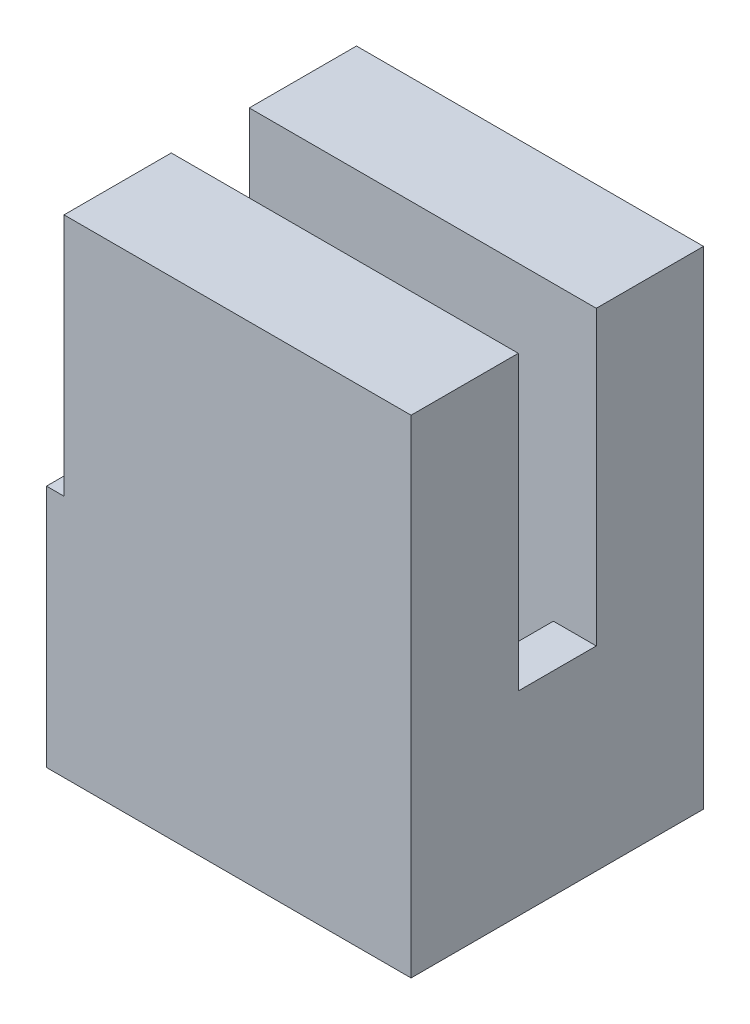
ISO-10303-21;
HEADER;
FILE_DESCRIPTION(('STEP AP214'),'2;1');
FILE_NAME('part.step','',(''),(''),'','','');
FILE_SCHEMA(('AUTOMOTIVE_DESIGN { 1 0 10303 214 1 1 1 1 }'));
ENDSEC;
DATA;
#1=APPLICATION_CONTEXT('core data for automotive mechanical design processes');
#2=APPLICATION_PROTOCOL_DEFINITION('international standard','automotive_design',2000,#1);
#3=PRODUCT_CONTEXT('',#1,'mechanical');
#4=PRODUCT('Part','Part','',(#3));
#5=PRODUCT_RELATED_PRODUCT_CATEGORY('part','',(#4));
#6=PRODUCT_DEFINITION_FORMATION('','',#4);
#7=PRODUCT_DEFINITION_CONTEXT('part definition',#1,'design');
#8=PRODUCT_DEFINITION('design','',#6,#7);
#9=PRODUCT_DEFINITION_SHAPE('','',#8);
#10=(LENGTH_UNIT() NAMED_UNIT(*) SI_UNIT(.MILLI.,.METRE.));
#11=(NAMED_UNIT(*) PLANE_ANGLE_UNIT() SI_UNIT($,.RADIAN.));
#12=(NAMED_UNIT(*) SI_UNIT($,.STERADIAN.) SOLID_ANGLE_UNIT());
#13=UNCERTAINTY_MEASURE_WITH_UNIT(LENGTH_MEASURE(1.E-05),#10,'distance_accuracy_value','');
#14=(GEOMETRIC_REPRESENTATION_CONTEXT(3) GLOBAL_UNCERTAINTY_ASSIGNED_CONTEXT((#13)) GLOBAL_UNIT_ASSIGNED_CONTEXT((#10,
#11,#12)) REPRESENTATION_CONTEXT('',''));
#15=CARTESIAN_POINT('',(0.,0.,0.));
#16=DIRECTION('',(0.,0.,1.));
#17=DIRECTION('',(1.,0.,0.));
#18=AXIS2_PLACEMENT_3D('',#15,#16,#17);
#19=CARTESIAN_POINT('',(0.,63.5,0.));
#20=DIRECTION('',(0.,1.,0.));
#21=DIRECTION('',(0.,0.,1.));
#22=AXIS2_PLACEMENT_3D('',#19,#20,#21);
#23=PLANE('',#22);
#24=DIRECTION('',(1.,0.,0.));
#25=VECTOR('',#24,1.);
#26=CARTESIAN_POINT('',(-23.749,63.5,5.08));
#27=LINE('',#26,#25);
#28=CARTESIAN_POINT('',(-21.463,63.5,5.07999999999999));
#29=VERTEX_POINT('',#28);
#30=CARTESIAN_POINT('',(23.749,63.5,5.08));
#31=VERTEX_POINT('',#30);
#32=EDGE_CURVE('E187',#29,#31,#27,.T.);
#33=ORIENTED_EDGE('',*,*,#32,.F.);
#34=DIRECTION('',(0.,0.,1.));
#35=VECTOR('',#34,1.);
#36=CARTESIAN_POINT('',(-21.463,63.5,-19.05));
#37=LINE('',#36,#35);
#38=CARTESIAN_POINT('',(-21.463,63.5,19.05));
#39=VERTEX_POINT('',#38);
#40=EDGE_CURVE('E174',#29,#39,#37,.T.);
#41=ORIENTED_EDGE('',*,*,#40,.T.);
#42=DIRECTION('',(1.,0.,0.));
#43=VECTOR('',#42,1.);
#44=CARTESIAN_POINT('',(-23.749,63.5,19.05));
#45=LINE('',#44,#43);
#46=CARTESIAN_POINT('',(23.749,63.5,19.05));
#47=VERTEX_POINT('',#46);
#48=EDGE_CURVE('E185',#39,#47,#45,.T.);
#49=ORIENTED_EDGE('',*,*,#48,.T.);
#50=DIRECTION('',(0.,0.,-1.));
#51=VECTOR('',#50,1.);
#52=CARTESIAN_POINT('',(23.749,63.5,-19.05));
#53=LINE('',#52,#51);
#54=EDGE_CURVE('E198',#47,#31,#53,.T.);
#55=ORIENTED_EDGE('',*,*,#54,.T.);
#56=EDGE_LOOP('',(#33,#41,#49,#55));
#57=FACE_BOUND('',#56,.T.);
#58=ADVANCED_FACE('F36',(#57),#23,.T.);
#59=CARTESIAN_POINT('',(-23.749,63.5,-19.05));
#60=DIRECTION('',(0.,0.,1.));
#61=DIRECTION('',(1.,0.,0.));
#62=AXIS2_PLACEMENT_3D('',#59,#60,#61);
#63=PLANE('',#62);
#64=DIRECTION('',(0.,1.,0.));
#65=VECTOR('',#64,1.);
#66=CARTESIAN_POINT('',(-21.463,-12.7685183888503,-19.05));
#67=LINE('',#66,#65);
#68=CARTESIAN_POINT('',(-21.463,31.75,-19.05));
#69=VERTEX_POINT('',#68);
#70=CARTESIAN_POINT('',(-21.463,63.5,-19.05));
#71=VERTEX_POINT('',#70);
#72=EDGE_CURVE('E179',#69,#71,#67,.T.);
#73=ORIENTED_EDGE('',*,*,#72,.T.);
#74=DIRECTION('',(-1.,0.,0.));
#75=VECTOR('',#74,1.);
#76=CARTESIAN_POINT('',(-23.749,63.5,-19.05));
#77=LINE('',#76,#75);
#78=CARTESIAN_POINT('',(23.749,63.5,-19.05));
#79=VERTEX_POINT('',#78);
#80=EDGE_CURVE('E193',#79,#71,#77,.T.);
#81=ORIENTED_EDGE('',*,*,#80,.F.);
#82=DIRECTION('',(0.,-1.,0.));
#83=VECTOR('',#82,1.);
#84=CARTESIAN_POINT('',(23.749,63.5,-19.05));
#85=LINE('',#84,#83);
#86=CARTESIAN_POINT('',(23.749,0.,-19.05));
#87=VERTEX_POINT('',#86);
#88=EDGE_CURVE('E219',#79,#87,#85,.T.);
#89=ORIENTED_EDGE('',*,*,#88,.T.);
#90=DIRECTION('',(-1.,0.,0.));
#91=VECTOR('',#90,1.);
#92=CARTESIAN_POINT('',(-23.749,0.,-19.05));
#93=LINE('',#92,#91);
#94=CARTESIAN_POINT('',(-23.749,0.,-19.05));
#95=VERTEX_POINT('',#94);
#96=EDGE_CURVE('E205',#87,#95,#93,.T.);
#97=ORIENTED_EDGE('',*,*,#96,.T.);
#98=DIRECTION('',(0.,-1.,0.));
#99=VECTOR('',#98,1.);
#100=CARTESIAN_POINT('',(-23.749,63.5,-19.05));
#101=LINE('',#100,#99);
#102=CARTESIAN_POINT('',(-23.749,31.75,-19.05));
#103=VERTEX_POINT('',#102);
#104=EDGE_CURVE('E217',#103,#95,#101,.T.);
#105=ORIENTED_EDGE('',*,*,#104,.F.);
#106=DIRECTION('',(-1.,0.,0.));
#107=VECTOR('',#106,1.);
#108=CARTESIAN_POINT('',(-23.749,31.75,-19.05));
#109=LINE('',#108,#107);
#110=EDGE_CURVE('E279',#69,#103,#109,.T.);
#111=ORIENTED_EDGE('',*,*,#110,.F.);
#112=EDGE_LOOP('',(#73,#81,#89,#97,#105,#111));
#113=FACE_BOUND('',#112,.T.);
#114=ADVANCED_FACE('F269',(#113),#63,.F.);
#115=CARTESIAN_POINT('',(-23.749,63.5,-19.05));
#116=DIRECTION('',(1.,0.,0.));
#117=DIRECTION('',(0.,0.,-1.));
#118=AXIS2_PLACEMENT_3D('',#115,#116,#117);
#119=PLANE('',#118);
#120=DIRECTION('',(0.,0.,-1.));
#121=VECTOR('',#120,1.);
#122=CARTESIAN_POINT('',(-23.749,31.75,-19.05));
#123=LINE('',#122,#121);
#124=CARTESIAN_POINT('',(-23.749,31.75,-5.08));
#125=VERTEX_POINT('',#124);
#126=EDGE_CURVE('E59',#125,#103,#123,.T.);
#127=ORIENTED_EDGE('',*,*,#126,.T.);
#128=ORIENTED_EDGE('',*,*,#104,.T.);
#129=DIRECTION('',(0.,0.,1.));
#130=VECTOR('',#129,1.);
#131=CARTESIAN_POINT('',(-23.749,0.,-19.05));
#132=LINE('',#131,#130);
#133=CARTESIAN_POINT('',(-23.749,0.,-8.5725));
#134=VERTEX_POINT('',#133);
#135=EDGE_CURVE('E210',#95,#134,#132,.T.);
#136=ORIENTED_EDGE('',*,*,#135,.T.);
#137=DIRECTION('',(0.,-1.,0.));
#138=VECTOR('',#137,1.);
#139=CARTESIAN_POINT('',(-23.749,70.681333074458,-8.5725));
#140=LINE('',#139,#138);
#141=CARTESIAN_POINT('',(-23.749,19.05,-8.5725));
#142=VERTEX_POINT('',#141);
#143=EDGE_CURVE('E333',#142,#134,#140,.T.);
#144=ORIENTED_EDGE('',*,*,#143,.F.);
#145=DIRECTION('',(0.,0.,-1.));
#146=VECTOR('',#145,1.);
#147=CARTESIAN_POINT('',(-23.749,19.05,-8.5725));
#148=LINE('',#147,#146);
#149=CARTESIAN_POINT('',(-23.749,19.05,8.5725));
#150=VERTEX_POINT('',#149);
#151=EDGE_CURVE('E334',#150,#142,#148,.T.);
#152=ORIENTED_EDGE('',*,*,#151,.F.);
#153=DIRECTION('',(0.,-1.,0.));
#154=VECTOR('',#153,1.);
#155=CARTESIAN_POINT('',(-23.749,70.681333074458,8.5725));
#156=LINE('',#155,#154);
#157=CARTESIAN_POINT('',(-23.749,0.,8.5725));
#158=VERTEX_POINT('',#157);
#159=EDGE_CURVE('E325',#150,#158,#156,.T.);
#160=ORIENTED_EDGE('',*,*,#159,.T.);
#161=CARTESIAN_POINT('',(-23.749,0.,19.05));
#162=VERTEX_POINT('',#161);
#163=EDGE_CURVE('E209',#158,#162,#132,.T.);
#164=ORIENTED_EDGE('',*,*,#163,.T.);
#165=DIRECTION('',(0.,-1.,0.));
#166=VECTOR('',#165,1.);
#167=CARTESIAN_POINT('',(-23.749,63.5,19.05));
#168=LINE('',#167,#166);
#169=CARTESIAN_POINT('',(-23.749,31.75,19.05));
#170=VERTEX_POINT('',#169);
#171=EDGE_CURVE('E195',#170,#162,#168,.T.);
#172=ORIENTED_EDGE('',*,*,#171,.F.);
#173=CARTESIAN_POINT('',(-23.749,31.75,5.08));
#174=VERTEX_POINT('',#173);
#175=EDGE_CURVE('E284',#170,#174,#123,.T.);
#176=ORIENTED_EDGE('',*,*,#175,.T.);
#177=DIRECTION('',(0.,1.,0.));
#178=VECTOR('',#177,1.);
#179=CARTESIAN_POINT('',(-23.749,25.4,5.08));
#180=LINE('',#179,#178);
#181=CARTESIAN_POINT('',(-23.749,25.4,5.08));
#182=VERTEX_POINT('',#181);
#183=EDGE_CURVE('E259',#182,#174,#180,.T.);
#184=ORIENTED_EDGE('',*,*,#183,.F.);
#185=DIRECTION('',(0.,0.,1.));
#186=VECTOR('',#185,1.);
#187=CARTESIAN_POINT('',(-23.749,25.4,-5.08));
#188=LINE('',#187,#186);
#189=CARTESIAN_POINT('',(-23.749,25.4,-5.08));
#190=VERTEX_POINT('',#189);
#191=EDGE_CURVE('E347',#190,#182,#188,.T.);
#192=ORIENTED_EDGE('',*,*,#191,.F.);
#193=DIRECTION('',(0.,1.,0.));
#194=VECTOR('',#193,1.);
#195=CARTESIAN_POINT('',(-23.749,25.4,-5.08));
#196=LINE('',#195,#194);
#197=EDGE_CURVE('E262',#190,#125,#196,.T.);
#198=ORIENTED_EDGE('',*,*,#197,.T.);
#199=EDGE_LOOP('',(#127,#128,#136,#144,#152,#160,#164,#172,#176,#184,#192,#198));
#200=FACE_BOUND('',#199,.T.);
#201=ADVANCED_FACE('F281',(#200),#119,.F.);
#202=CARTESIAN_POINT('',(-23.749,63.5,19.05));
#203=DIRECTION('',(0.,0.,-1.));
#204=DIRECTION('',(-1.,0.,0.));
#205=AXIS2_PLACEMENT_3D('',#202,#203,#204);
#206=PLANE('',#205);
#207=DIRECTION('',(0.,1.,0.));
#208=VECTOR('',#207,1.);
#209=CARTESIAN_POINT('',(-21.463,-12.7685183888503,19.05));
#210=LINE('',#209,#208);
#211=CARTESIAN_POINT('',(-21.463,31.75,19.05));
#212=VERTEX_POINT('',#211);
#213=EDGE_CURVE('E171',#212,#39,#210,.T.);
#214=ORIENTED_EDGE('',*,*,#213,.F.);
#215=DIRECTION('',(-1.,0.,0.));
#216=VECTOR('',#215,1.);
#217=CARTESIAN_POINT('',(-23.749,31.75,19.05));
#218=LINE('',#217,#216);
#219=EDGE_CURVE('E287',#212,#170,#218,.T.);
#220=ORIENTED_EDGE('',*,*,#219,.T.);
#221=ORIENTED_EDGE('',*,*,#171,.T.);
#222=DIRECTION('',(1.,0.,0.));
#223=VECTOR('',#222,1.);
#224=CARTESIAN_POINT('',(-23.749,0.,19.05));
#225=LINE('',#224,#223);
#226=CARTESIAN_POINT('',(23.749,0.,19.05));
#227=VERTEX_POINT('',#226);
#228=EDGE_CURVE('E213',#162,#227,#225,.T.);
#229=ORIENTED_EDGE('',*,*,#228,.T.);
#230=DIRECTION('',(0.,-1.,0.));
#231=VECTOR('',#230,1.);
#232=CARTESIAN_POINT('',(23.749,63.5,19.05));
#233=LINE('',#232,#231);
#234=EDGE_CURVE('E191',#47,#227,#233,.T.);
#235=ORIENTED_EDGE('',*,*,#234,.F.);
#236=ORIENTED_EDGE('',*,*,#48,.F.);
#237=EDGE_LOOP('',(#214,#220,#221,#229,#235,#236));
#238=FACE_BOUND('',#237,.T.);
#239=ADVANCED_FACE('F189',(#238),#206,.F.);
#240=ORIENTED_EDGE('',*,*,#80,.T.);
#241=CARTESIAN_POINT('',(-21.463,63.5,-5.08));
#242=VERTEX_POINT('',#241);
#243=EDGE_CURVE('E180',#71,#242,#37,.T.);
#244=ORIENTED_EDGE('',*,*,#243,.T.);
#245=DIRECTION('',(-1.,0.,0.));
#246=VECTOR('',#245,1.);
#247=CARTESIAN_POINT('',(-23.749,63.5,-5.08));
#248=LINE('',#247,#246);
#249=CARTESIAN_POINT('',(23.749,63.5,-5.08));
#250=VERTEX_POINT('',#249);
#251=EDGE_CURVE('E241',#250,#242,#248,.T.);
#252=ORIENTED_EDGE('',*,*,#251,.F.);
#253=EDGE_CURVE('E214',#250,#79,#53,.T.);
#254=ORIENTED_EDGE('',*,*,#253,.T.);
#255=EDGE_LOOP('',(#240,#244,#252,#254));
#256=FACE_BOUND('',#255,.T.);
#257=ADVANCED_FACE('F265',(#256),#23,.T.);
#258=CARTESIAN_POINT('',(-23.749,25.4,5.08));
#259=DIRECTION('',(0.,0.,1.));
#260=DIRECTION('',(1.,0.,0.));
#261=AXIS2_PLACEMENT_3D('',#258,#259,#260);
#262=PLANE('',#261);
#263=DIRECTION('',(0.,-1.,0.));
#264=VECTOR('',#263,1.);
#265=CARTESIAN_POINT('',(-21.463,25.4,5.08));
#266=LINE('',#265,#264);
#267=CARTESIAN_POINT('',(-21.463,31.75,5.08));
#268=VERTEX_POINT('',#267);
#269=EDGE_CURVE('E294',#29,#268,#266,.T.);
#270=ORIENTED_EDGE('',*,*,#269,.F.);
#271=ORIENTED_EDGE('',*,*,#32,.T.);
#272=DIRECTION('',(0.,1.,0.));
#273=VECTOR('',#272,1.);
#274=CARTESIAN_POINT('',(23.749,25.4,5.08));
#275=LINE('',#274,#273);
#276=CARTESIAN_POINT('',(23.749,25.4,5.08));
#277=VERTEX_POINT('',#276);
#278=EDGE_CURVE('E206',#277,#31,#275,.T.);
#279=ORIENTED_EDGE('',*,*,#278,.F.);
#280=DIRECTION('',(1.,0.,0.));
#281=VECTOR('',#280,1.);
#282=CARTESIAN_POINT('',(-23.749,25.4,5.08));
#283=LINE('',#282,#281);
#284=CARTESIAN_POINT('',(18.161,25.4,5.08));
#285=VERTEX_POINT('',#284);
#286=EDGE_CURVE('E348',#285,#277,#283,.T.);
#287=ORIENTED_EDGE('',*,*,#286,.F.);
#288=DIRECTION('',(0.,1.,0.));
#289=VECTOR('',#288,1.);
#290=CARTESIAN_POINT('',(18.161,0.,5.08));
#291=LINE('',#290,#289);
#292=CARTESIAN_POINT('',(18.161,19.05,5.08));
#293=VERTEX_POINT('',#292);
#294=EDGE_CURVE('E302',#293,#285,#291,.T.);
#295=ORIENTED_EDGE('',*,*,#294,.F.);
#296=DIRECTION('',(1.,0.,0.));
#297=VECTOR('',#296,1.);
#298=CARTESIAN_POINT('',(0.,19.05,5.08));
#299=LINE('',#298,#297);
#300=CARTESIAN_POINT('',(-21.971,19.05,5.08));
#301=VERTEX_POINT('',#300);
#302=EDGE_CURVE('E313',#301,#293,#299,.T.);
#303=ORIENTED_EDGE('',*,*,#302,.F.);
#304=DIRECTION('',(0.,1.,0.));
#305=VECTOR('',#304,1.);
#306=CARTESIAN_POINT('',(-21.971,0.,5.08));
#307=LINE('',#306,#305);
#308=CARTESIAN_POINT('',(-21.971,25.4,5.08));
#309=VERTEX_POINT('',#308);
#310=EDGE_CURVE('E305',#301,#309,#307,.T.);
#311=ORIENTED_EDGE('',*,*,#310,.T.);
#312=EDGE_CURVE('E254',#182,#309,#283,.T.);
#313=ORIENTED_EDGE('',*,*,#312,.F.);
#314=ORIENTED_EDGE('',*,*,#183,.T.);
#315=DIRECTION('',(-1.,0.,0.));
#316=VECTOR('',#315,1.);
#317=CARTESIAN_POINT('',(-23.749,31.75,5.08));
#318=LINE('',#317,#316);
#319=EDGE_CURVE('E290',#268,#174,#318,.T.);
#320=ORIENTED_EDGE('',*,*,#319,.F.);
#321=EDGE_LOOP('',(#270,#271,#279,#287,#295,#303,#311,#313,#314,#320));
#322=FACE_BOUND('',#321,.T.);
#323=ADVANCED_FACE('F361',(#322),#262,.F.);
#324=CARTESIAN_POINT('',(-23.749,25.4,-5.08));
#325=DIRECTION('',(0.,0.,-1.));
#326=DIRECTION('',(-1.,0.,0.));
#327=AXIS2_PLACEMENT_3D('',#324,#325,#326);
#328=PLANE('',#327);
#329=DIRECTION('',(0.,1.,0.));
#330=VECTOR('',#329,1.);
#331=CARTESIAN_POINT('',(-21.463,25.4,-5.08));
#332=LINE('',#331,#330);
#333=CARTESIAN_POINT('',(-21.463,31.75,-5.08));
#334=VERTEX_POINT('',#333);
#335=EDGE_CURVE('E13',#334,#242,#332,.T.);
#336=ORIENTED_EDGE('',*,*,#335,.F.);
#337=DIRECTION('',(1.,0.,0.));
#338=VECTOR('',#337,1.);
#339=CARTESIAN_POINT('',(-23.749,31.75,-5.08));
#340=LINE('',#339,#338);
#341=EDGE_CURVE('E44',#125,#334,#340,.T.);
#342=ORIENTED_EDGE('',*,*,#341,.F.);
#343=ORIENTED_EDGE('',*,*,#197,.F.);
#344=DIRECTION('',(-1.,0.,0.));
#345=VECTOR('',#344,1.);
#346=CARTESIAN_POINT('',(-23.749,25.4,-5.08));
#347=LINE('',#346,#345);
#348=CARTESIAN_POINT('',(-21.971,25.4,-5.08));
#349=VERTEX_POINT('',#348);
#350=EDGE_CURVE('E344',#349,#190,#347,.T.);
#351=ORIENTED_EDGE('',*,*,#350,.F.);
#352=DIRECTION('',(0.,1.,0.));
#353=VECTOR('',#352,1.);
#354=CARTESIAN_POINT('',(-21.971,0.,-5.08));
#355=LINE('',#354,#353);
#356=CARTESIAN_POINT('',(-21.971,19.05,-5.08));
#357=VERTEX_POINT('',#356);
#358=EDGE_CURVE('E307',#357,#349,#355,.T.);
#359=ORIENTED_EDGE('',*,*,#358,.F.);
#360=DIRECTION('',(-1.,0.,0.));
#361=VECTOR('',#360,1.);
#362=CARTESIAN_POINT('',(0.,19.05,-5.08));
#363=LINE('',#362,#361);
#364=CARTESIAN_POINT('',(18.161,19.05,-5.08));
#365=VERTEX_POINT('',#364);
#366=EDGE_CURVE('E304',#365,#357,#363,.T.);
#367=ORIENTED_EDGE('',*,*,#366,.F.);
#368=DIRECTION('',(0.,1.,0.));
#369=VECTOR('',#368,1.);
#370=CARTESIAN_POINT('',(18.161,0.,-5.08));
#371=LINE('',#370,#369);
#372=CARTESIAN_POINT('',(18.161,25.4,-5.08));
#373=VERTEX_POINT('',#372);
#374=EDGE_CURVE('E301',#365,#373,#371,.T.);
#375=ORIENTED_EDGE('',*,*,#374,.T.);
#376=CARTESIAN_POINT('',(23.749,25.4,-5.08));
#377=VERTEX_POINT('',#376);
#378=EDGE_CURVE('E345',#377,#373,#347,.T.);
#379=ORIENTED_EDGE('',*,*,#378,.F.);
#380=DIRECTION('',(0.,1.,0.));
#381=VECTOR('',#380,1.);
#382=CARTESIAN_POINT('',(23.749,25.4,-5.08));
#383=LINE('',#382,#381);
#384=EDGE_CURVE('E243',#377,#250,#383,.T.);
#385=ORIENTED_EDGE('',*,*,#384,.T.);
#386=ORIENTED_EDGE('',*,*,#251,.T.);
#387=EDGE_LOOP('',(#336,#342,#343,#351,#359,#367,#375,#379,#385,#386));
#388=FACE_BOUND('',#387,.T.);
#389=ADVANCED_FACE('F239',(#388),#328,.F.);
#390=CARTESIAN_POINT('',(0.,25.4,0.));
#391=DIRECTION('',(0.,1.,0.));
#392=DIRECTION('',(0.,0.,1.));
#393=AXIS2_PLACEMENT_3D('',#390,#391,#392);
#394=PLANE('',#393);
#395=DIRECTION('',(0.,0.,-1.));
#396=VECTOR('',#395,1.);
#397=CARTESIAN_POINT('',(18.161,25.4,5.08));
#398=LINE('',#397,#396);
#399=EDGE_CURVE('E296',#285,#373,#398,.T.);
#400=ORIENTED_EDGE('',*,*,#399,.F.);
#401=ORIENTED_EDGE('',*,*,#286,.T.);
#402=DIRECTION('',(0.,0.,-1.));
#403=VECTOR('',#402,1.);
#404=CARTESIAN_POINT('',(23.749,25.4,-5.08));
#405=LINE('',#404,#403);
#406=EDGE_CURVE('E248',#277,#377,#405,.T.);
#407=ORIENTED_EDGE('',*,*,#406,.T.);
#408=ORIENTED_EDGE('',*,*,#378,.T.);
#409=EDGE_LOOP('',(#400,#401,#407,#408));
#410=FACE_BOUND('',#409,.T.);
#411=ADVANCED_FACE('F386',(#410),#394,.T.);
#412=CARTESIAN_POINT('',(23.749,63.5,-19.05));
#413=DIRECTION('',(-1.,0.,0.));
#414=DIRECTION('',(0.,0.,1.));
#415=AXIS2_PLACEMENT_3D('',#412,#413,#414);
#416=PLANE('',#415);
#417=ORIENTED_EDGE('',*,*,#406,.F.);
#418=ORIENTED_EDGE('',*,*,#278,.T.);
#419=ORIENTED_EDGE('',*,*,#54,.F.);
#420=ORIENTED_EDGE('',*,*,#234,.T.);
#421=DIRECTION('',(0.,0.,-1.));
#422=VECTOR('',#421,1.);
#423=CARTESIAN_POINT('',(23.749,0.,-19.05));
#424=LINE('',#423,#422);
#425=EDGE_CURVE('E202',#227,#87,#424,.T.);
#426=ORIENTED_EDGE('',*,*,#425,.T.);
#427=ORIENTED_EDGE('',*,*,#88,.F.);
#428=ORIENTED_EDGE('',*,*,#253,.F.);
#429=ORIENTED_EDGE('',*,*,#384,.F.);
#430=EDGE_LOOP('',(#417,#418,#419,#420,#426,#427,#428,#429));
#431=FACE_BOUND('',#430,.T.);
#432=ADVANCED_FACE('F38',(#431),#416,.F.);
#433=CARTESIAN_POINT('',(0.,0.,0.));
#434=DIRECTION('',(0.,1.,0.));
#435=DIRECTION('',(0.,0.,1.));
#436=AXIS2_PLACEMENT_3D('',#433,#434,#435);
#437=PLANE('',#436);
#438=ORIENTED_EDGE('',*,*,#163,.F.);
#439=DIRECTION('',(-1.,0.,0.));
#440=VECTOR('',#439,1.);
#441=CARTESIAN_POINT('',(-23.749,0.,8.5725));
#442=LINE('',#441,#440);
#443=CARTESIAN_POINT('',(18.161,0.,8.5725));
#444=VERTEX_POINT('',#443);
#445=EDGE_CURVE('E320',#444,#158,#442,.T.);
#446=ORIENTED_EDGE('',*,*,#445,.F.);
#447=DIRECTION('',(0.,0.,1.));
#448=VECTOR('',#447,1.);
#449=CARTESIAN_POINT('',(18.161,0.,-8.5725));
#450=LINE('',#449,#448);
#451=CARTESIAN_POINT('',(18.161,0.,-8.5725));
#452=VERTEX_POINT('',#451);
#453=EDGE_CURVE('E316',#452,#444,#450,.T.);
#454=ORIENTED_EDGE('',*,*,#453,.F.);
#455=DIRECTION('',(1.,0.,0.));
#456=VECTOR('',#455,1.);
#457=CARTESIAN_POINT('',(-23.749,0.,-8.5725));
#458=LINE('',#457,#456);
#459=EDGE_CURVE('E317',#134,#452,#458,.T.);
#460=ORIENTED_EDGE('',*,*,#459,.F.);
#461=ORIENTED_EDGE('',*,*,#135,.F.);
#462=ORIENTED_EDGE('',*,*,#96,.F.);
#463=ORIENTED_EDGE('',*,*,#425,.F.);
#464=ORIENTED_EDGE('',*,*,#228,.F.);
#465=EDGE_LOOP('',(#438,#446,#454,#460,#461,#462,#463,#464));
#466=FACE_BOUND('',#465,.T.);
#467=ADVANCED_FACE('F275',(#466),#437,.F.);
#468=DIRECTION('',(0.,0.,1.));
#469=VECTOR('',#468,1.);
#470=CARTESIAN_POINT('',(-21.971,25.4,5.08));
#471=LINE('',#470,#469);
#472=EDGE_CURVE('E298',#349,#309,#471,.T.);
#473=ORIENTED_EDGE('',*,*,#472,.F.);
#474=ORIENTED_EDGE('',*,*,#350,.T.);
#475=ORIENTED_EDGE('',*,*,#191,.T.);
#476=ORIENTED_EDGE('',*,*,#312,.T.);
#477=EDGE_LOOP('',(#473,#474,#475,#476));
#478=FACE_BOUND('',#477,.T.);
#479=ADVANCED_FACE('F357',(#478),#394,.T.);
#480=CARTESIAN_POINT('',(0.,19.05,0.));
#481=DIRECTION('',(0.,1.,0.));
#482=DIRECTION('',(0.,0.,1.));
#483=AXIS2_PLACEMENT_3D('',#480,#481,#482);
#484=PLANE('',#483);
#485=DIRECTION('',(0.,0.,1.));
#486=VECTOR('',#485,1.);
#487=CARTESIAN_POINT('',(-21.971,19.05,0.));
#488=LINE('',#487,#486);
#489=EDGE_CURVE('E222',#357,#301,#488,.T.);
#490=ORIENTED_EDGE('',*,*,#489,.T.);
#491=ORIENTED_EDGE('',*,*,#302,.T.);
#492=DIRECTION('',(0.,0.,1.));
#493=VECTOR('',#492,1.);
#494=CARTESIAN_POINT('',(18.161,19.05,-8.5725));
#495=LINE('',#494,#493);
#496=CARTESIAN_POINT('',(18.161,19.05,8.5725));
#497=VERTEX_POINT('',#496);
#498=EDGE_CURVE('E328',#293,#497,#495,.T.);
#499=ORIENTED_EDGE('',*,*,#498,.T.);
#500=DIRECTION('',(-1.,0.,0.));
#501=VECTOR('',#500,1.);
#502=CARTESIAN_POINT('',(-23.749,19.05,8.5725));
#503=LINE('',#502,#501);
#504=EDGE_CURVE('E319',#497,#150,#503,.T.);
#505=ORIENTED_EDGE('',*,*,#504,.T.);
#506=ORIENTED_EDGE('',*,*,#151,.T.);
#507=DIRECTION('',(1.,0.,0.));
#508=VECTOR('',#507,1.);
#509=CARTESIAN_POINT('',(-23.749,19.05,-8.5725));
#510=LINE('',#509,#508);
#511=CARTESIAN_POINT('',(18.161,19.05,-8.5725));
#512=VERTEX_POINT('',#511);
#513=EDGE_CURVE('E329',#142,#512,#510,.T.);
#514=ORIENTED_EDGE('',*,*,#513,.T.);
#515=EDGE_CURVE('E251',#512,#365,#495,.T.);
#516=ORIENTED_EDGE('',*,*,#515,.T.);
#517=ORIENTED_EDGE('',*,*,#366,.T.);
#518=EDGE_LOOP('',(#490,#491,#499,#505,#506,#514,#516,#517));
#519=FACE_BOUND('',#518,.T.);
#520=ADVANCED_FACE('F382',(#519),#484,.F.);
#521=CARTESIAN_POINT('',(-23.749,70.681333074458,8.5725));
#522=DIRECTION('',(0.,0.,1.));
#523=DIRECTION('',(1.,0.,0.));
#524=AXIS2_PLACEMENT_3D('',#521,#522,#523);
#525=PLANE('',#524);
#526=DIRECTION('',(0.,-1.,0.));
#527=VECTOR('',#526,1.);
#528=CARTESIAN_POINT('',(18.161,70.681333074458,8.5725));
#529=LINE('',#528,#527);
#530=EDGE_CURVE('E246',#497,#444,#529,.T.);
#531=ORIENTED_EDGE('',*,*,#530,.T.);
#532=ORIENTED_EDGE('',*,*,#445,.T.);
#533=ORIENTED_EDGE('',*,*,#159,.F.);
#534=ORIENTED_EDGE('',*,*,#504,.F.);
#535=EDGE_LOOP('',(#531,#532,#533,#534));
#536=FACE_BOUND('',#535,.T.);
#537=ADVANCED_FACE('F371',(#536),#525,.F.);
#538=CARTESIAN_POINT('',(-23.749,70.681333074458,-8.5725));
#539=DIRECTION('',(0.,0.,-1.));
#540=DIRECTION('',(-1.,0.,0.));
#541=AXIS2_PLACEMENT_3D('',#538,#539,#540);
#542=PLANE('',#541);
#543=ORIENTED_EDGE('',*,*,#143,.T.);
#544=ORIENTED_EDGE('',*,*,#459,.T.);
#545=DIRECTION('',(0.,-1.,0.));
#546=VECTOR('',#545,1.);
#547=CARTESIAN_POINT('',(18.161,70.681333074458,-8.5725));
#548=LINE('',#547,#546);
#549=EDGE_CURVE('E332',#512,#452,#548,.T.);
#550=ORIENTED_EDGE('',*,*,#549,.F.);
#551=ORIENTED_EDGE('',*,*,#513,.F.);
#552=EDGE_LOOP('',(#543,#544,#550,#551));
#553=FACE_BOUND('',#552,.T.);
#554=ADVANCED_FACE('F380',(#553),#542,.F.);
#555=CARTESIAN_POINT('',(18.161,70.681333074458,-8.5725));
#556=DIRECTION('',(1.,0.,0.));
#557=DIRECTION('',(0.,0.,-1.));
#558=AXIS2_PLACEMENT_3D('',#555,#556,#557);
#559=PLANE('',#558);
#560=ORIENTED_EDGE('',*,*,#453,.T.);
#561=ORIENTED_EDGE('',*,*,#530,.F.);
#562=ORIENTED_EDGE('',*,*,#498,.F.);
#563=ORIENTED_EDGE('',*,*,#294,.T.);
#564=ORIENTED_EDGE('',*,*,#399,.T.);
#565=ORIENTED_EDGE('',*,*,#374,.F.);
#566=ORIENTED_EDGE('',*,*,#515,.F.);
#567=ORIENTED_EDGE('',*,*,#549,.T.);
#568=EDGE_LOOP('',(#560,#561,#562,#563,#564,#565,#566,#567));
#569=FACE_BOUND('',#568,.T.);
#570=ADVANCED_FACE('F376',(#569),#559,.F.);
#571=CARTESIAN_POINT('',(-21.971,0.,5.08));
#572=DIRECTION('',(-1.,0.,0.));
#573=DIRECTION('',(0.,0.,1.));
#574=AXIS2_PLACEMENT_3D('',#571,#572,#573);
#575=PLANE('',#574);
#576=ORIENTED_EDGE('',*,*,#358,.T.);
#577=ORIENTED_EDGE('',*,*,#472,.T.);
#578=ORIENTED_EDGE('',*,*,#310,.F.);
#579=ORIENTED_EDGE('',*,*,#489,.F.);
#580=EDGE_LOOP('',(#576,#577,#578,#579));
#581=FACE_BOUND('',#580,.T.);
#582=ADVANCED_FACE('F385',(#581),#575,.F.);
#583=CARTESIAN_POINT('',(0.,31.75,0.));
#584=DIRECTION('',(0.,1.,0.));
#585=DIRECTION('',(0.,0.,1.));
#586=AXIS2_PLACEMENT_3D('',#583,#584,#585);
#587=PLANE('',#586);
#588=ORIENTED_EDGE('',*,*,#341,.T.);
#589=DIRECTION('',(0.,0.,-1.));
#590=VECTOR('',#589,1.);
#591=CARTESIAN_POINT('',(-21.463,31.75,-19.05));
#592=LINE('',#591,#590);
#593=EDGE_CURVE('E226',#334,#69,#592,.T.);
#594=ORIENTED_EDGE('',*,*,#593,.T.);
#595=ORIENTED_EDGE('',*,*,#110,.T.);
#596=ORIENTED_EDGE('',*,*,#126,.F.);
#597=EDGE_LOOP('',(#588,#594,#595,#596));
#598=FACE_BOUND('',#597,.T.);
#599=ADVANCED_FACE('F225',(#598),#587,.T.);
#600=CARTESIAN_POINT('',(-21.463,-12.7685183888503,-19.05));
#601=DIRECTION('',(-1.,0.,0.));
#602=DIRECTION('',(0.,0.,1.));
#603=AXIS2_PLACEMENT_3D('',#600,#601,#602);
#604=PLANE('',#603);
#605=ORIENTED_EDGE('',*,*,#335,.T.);
#606=ORIENTED_EDGE('',*,*,#243,.F.);
#607=ORIENTED_EDGE('',*,*,#72,.F.);
#608=ORIENTED_EDGE('',*,*,#593,.F.);
#609=EDGE_LOOP('',(#605,#606,#607,#608));
#610=FACE_BOUND('',#609,.T.);
#611=ADVANCED_FACE('F233',(#610),#604,.T.);
#612=ORIENTED_EDGE('',*,*,#269,.T.);
#613=EDGE_CURVE('E51',#212,#268,#592,.T.);
#614=ORIENTED_EDGE('',*,*,#613,.F.);
#615=ORIENTED_EDGE('',*,*,#213,.T.);
#616=ORIENTED_EDGE('',*,*,#40,.F.);
#617=EDGE_LOOP('',(#612,#614,#615,#616));
#618=FACE_BOUND('',#617,.T.);
#619=ADVANCED_FACE('F173',(#618),#604,.T.);
#620=ORIENTED_EDGE('',*,*,#319,.T.);
#621=ORIENTED_EDGE('',*,*,#175,.F.);
#622=ORIENTED_EDGE('',*,*,#219,.F.);
#623=ORIENTED_EDGE('',*,*,#613,.T.);
#624=EDGE_LOOP('',(#620,#621,#622,#623));
#625=FACE_BOUND('',#624,.T.);
#626=ADVANCED_FACE('F366',(#625),#587,.T.);
#627=CLOSED_SHELL('',(#58,#114,#201,#239,#257,#323,#389,#411,#432,#467,#479,#520,#537,#554,#570,
#582,#599,#611,#619,#626));
#628=MANIFOLD_SOLID_BREP('B2',#627);
#629=ADVANCED_BREP_SHAPE_REPRESENTATION('',(#18,#628),#14);
#630=SHAPE_DEFINITION_REPRESENTATION(#9,#629);
ENDSEC;
END-ISO-10303-21;
